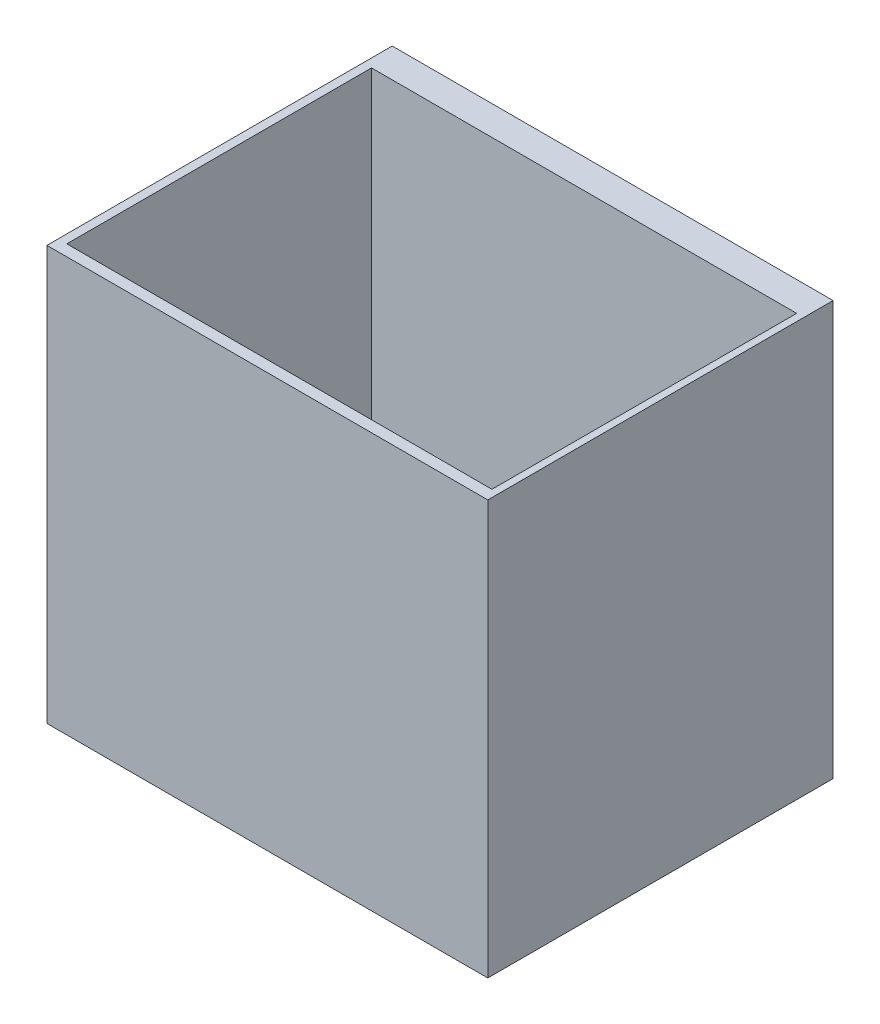
ISO-10303-21;
HEADER;
FILE_DESCRIPTION(('STEP AP214'),'2;1');
FILE_NAME('part.step','',(''),(''),'','','');
FILE_SCHEMA(('AUTOMOTIVE_DESIGN { 1 0 10303 214 1 1 1 1 }'));
ENDSEC;
DATA;
#1=APPLICATION_CONTEXT('core data for automotive mechanical design processes');
#2=APPLICATION_PROTOCOL_DEFINITION('international standard','automotive_design',2000,#1);
#3=PRODUCT_CONTEXT('',#1,'mechanical');
#4=PRODUCT('Part','Part','',(#3));
#5=PRODUCT_RELATED_PRODUCT_CATEGORY('part','',(#4));
#6=PRODUCT_DEFINITION_FORMATION('','',#4);
#7=PRODUCT_DEFINITION_CONTEXT('part definition',#1,'design');
#8=PRODUCT_DEFINITION('design','',#6,#7);
#9=PRODUCT_DEFINITION_SHAPE('','',#8);
#10=(LENGTH_UNIT() NAMED_UNIT(*) SI_UNIT(.MILLI.,.METRE.));
#11=(NAMED_UNIT(*) PLANE_ANGLE_UNIT() SI_UNIT($,.RADIAN.));
#12=(NAMED_UNIT(*) SI_UNIT($,.STERADIAN.) SOLID_ANGLE_UNIT());
#13=UNCERTAINTY_MEASURE_WITH_UNIT(LENGTH_MEASURE(1.E-05),#10,'distance_accuracy_value','');
#14=(GEOMETRIC_REPRESENTATION_CONTEXT(3) GLOBAL_UNCERTAINTY_ASSIGNED_CONTEXT((#13)) GLOBAL_UNIT_ASSIGNED_CONTEXT((#10,
#11,#12)) REPRESENTATION_CONTEXT('',''));
#15=CARTESIAN_POINT('',(0.,0.,0.));
#16=DIRECTION('',(0.,0.,1.));
#17=DIRECTION('',(1.,0.,0.));
#18=AXIS2_PLACEMENT_3D('',#15,#16,#17);
#19=CARTESIAN_POINT('',(518.159541103016,768.999999999999,2136.51077616825));
#20=DIRECTION('',(1.,0.,0.));
#21=DIRECTION('',(0.,0.,-1.));
#22=AXIS2_PLACEMENT_3D('',#19,#20,#21);
#23=PLANE('',#22);
#24=DIRECTION('',(0.,-1.,0.));
#25=VECTOR('',#24,1.);
#26=CARTESIAN_POINT('',(518.159541103016,768.999999999999,1653.51077616825));
#27=LINE('',#26,#25);
#28=CARTESIAN_POINT('',(518.159541103016,768.999999999999,1653.51077616825));
#29=VERTEX_POINT('',#28);
#30=CARTESIAN_POINT('',(518.159541103016,189.834965462087,1653.51077616825));
#31=VERTEX_POINT('',#30);
#32=EDGE_CURVE('E172',#29,#31,#27,.T.);
#33=ORIENTED_EDGE('',*,*,#32,.T.);
#34=DIRECTION('',(0.,0.,-1.));
#35=VECTOR('',#34,1.);
#36=CARTESIAN_POINT('',(518.159541103016,189.834965462087,2136.51077616825));
#37=LINE('',#36,#35);
#38=CARTESIAN_POINT('',(518.159541103016,189.834965462087,2136.51077616825));
#39=VERTEX_POINT('',#38);
#40=EDGE_CURVE('E11',#39,#31,#37,.T.);
#41=ORIENTED_EDGE('',*,*,#40,.F.);
#42=DIRECTION('',(0.,-1.,0.));
#43=VECTOR('',#42,1.);
#44=CARTESIAN_POINT('',(518.159541103016,768.999999999999,2136.51077616825));
#45=LINE('',#44,#43);
#46=CARTESIAN_POINT('',(518.159541103016,768.999999999999,2136.51077616825));
#47=VERTEX_POINT('',#46);
#48=EDGE_CURVE('E178',#47,#39,#45,.T.);
#49=ORIENTED_EDGE('',*,*,#48,.F.);
#50=DIRECTION('',(0.,0.,-1.));
#51=VECTOR('',#50,1.);
#52=CARTESIAN_POINT('',(518.159541103016,768.999999999999,2136.51077616825));
#53=LINE('',#52,#51);
#54=EDGE_CURVE('E188',#47,#29,#53,.T.);
#55=ORIENTED_EDGE('',*,*,#54,.T.);
#56=EDGE_LOOP('',(#33,#41,#49,#55));
#57=FACE_BOUND('',#56,.T.);
#58=ADVANCED_FACE('F33',(#57),#23,.F.);
#59=CARTESIAN_POINT('',(518.159541103016,189.834965462087,2136.51077616825));
#60=DIRECTION('',(0.,1.,0.));
#61=DIRECTION('',(0.,0.,1.));
#62=AXIS2_PLACEMENT_3D('',#59,#60,#61);
#63=PLANE('',#62);
#64=DIRECTION('',(1.,0.,0.));
#65=VECTOR('',#64,1.);
#66=CARTESIAN_POINT('',(518.159541103016,189.834965462087,1653.51077616825));
#67=LINE('',#66,#65);
#68=CARTESIAN_POINT('',(1134.86751024174,189.834965462087,1653.51077616825));
#69=VERTEX_POINT('',#68);
#70=EDGE_CURVE('E191',#31,#69,#67,.T.);
#71=ORIENTED_EDGE('',*,*,#70,.T.);
#72=DIRECTION('',(0.,0.,-1.));
#73=VECTOR('',#72,1.);
#74=CARTESIAN_POINT('',(1134.86751024174,189.834965462087,2136.51077616825));
#75=LINE('',#74,#73);
#76=CARTESIAN_POINT('',(1134.86751024174,189.834965462087,2136.51077616825));
#77=VERTEX_POINT('',#76);
#78=EDGE_CURVE('E40',#77,#69,#75,.T.);
#79=ORIENTED_EDGE('',*,*,#78,.F.);
#80=DIRECTION('',(1.,0.,0.));
#81=VECTOR('',#80,1.);
#82=CARTESIAN_POINT('',(518.159541103016,189.834965462087,2136.51077616825));
#83=LINE('',#82,#81);
#84=EDGE_CURVE('E181',#39,#77,#83,.T.);
#85=ORIENTED_EDGE('',*,*,#84,.F.);
#86=ORIENTED_EDGE('',*,*,#40,.T.);
#87=EDGE_LOOP('',(#71,#79,#85,#86));
#88=FACE_BOUND('',#87,.T.);
#89=ADVANCED_FACE('F219',(#88),#63,.F.);
#90=CARTESIAN_POINT('',(1134.86751024174,768.999999999999,2136.51077616825));
#91=DIRECTION('',(-1.,0.,0.));
#92=DIRECTION('',(0.,0.,1.));
#93=AXIS2_PLACEMENT_3D('',#90,#91,#92);
#94=PLANE('',#93);
#95=DIRECTION('',(0.,1.,0.));
#96=VECTOR('',#95,1.);
#97=CARTESIAN_POINT('',(1134.86751024174,768.999999999999,1653.51077616825));
#98=LINE('',#97,#96);
#99=CARTESIAN_POINT('',(1134.86751024174,768.999999999999,1653.51077616825));
#100=VERTEX_POINT('',#99);
#101=EDGE_CURVE('E193',#69,#100,#98,.T.);
#102=ORIENTED_EDGE('',*,*,#101,.T.);
#103=DIRECTION('',(0.,0.,-1.));
#104=VECTOR('',#103,1.);
#105=CARTESIAN_POINT('',(1134.86751024174,768.999999999999,2136.51077616825));
#106=LINE('',#105,#104);
#107=CARTESIAN_POINT('',(1134.86751024174,768.999999999999,2136.51077616825));
#108=VERTEX_POINT('',#107);
#109=EDGE_CURVE('E198',#108,#100,#106,.T.);
#110=ORIENTED_EDGE('',*,*,#109,.F.);
#111=DIRECTION('',(0.,1.,0.));
#112=VECTOR('',#111,1.);
#113=CARTESIAN_POINT('',(1134.86751024174,768.999999999999,2136.51077616825));
#114=LINE('',#113,#112);
#115=EDGE_CURVE('E184',#77,#108,#114,.T.);
#116=ORIENTED_EDGE('',*,*,#115,.F.);
#117=ORIENTED_EDGE('',*,*,#78,.T.);
#118=EDGE_LOOP('',(#102,#110,#116,#117));
#119=FACE_BOUND('',#118,.T.);
#120=ADVANCED_FACE('F205',(#119),#94,.F.);
#121=CARTESIAN_POINT('',(518.159541103016,768.999999999999,2136.51077616825));
#122=DIRECTION('',(0.,-1.,0.));
#123=DIRECTION('',(0.,0.,-1.));
#124=AXIS2_PLACEMENT_3D('',#121,#122,#123);
#125=PLANE('',#124);
#126=DIRECTION('',(-1.,0.,0.));
#127=VECTOR('',#126,1.);
#128=CARTESIAN_POINT('',(1124.90315803905,768.999999999999,1694.51391611529));
#129=LINE('',#128,#127);
#130=CARTESIAN_POINT('',(1124.90315803905,768.999999999999,1694.51391611529));
#131=VERTEX_POINT('',#130);
#132=CARTESIAN_POINT('',(530.230922992201,768.999999999999,1694.51391611529));
#133=VERTEX_POINT('',#132);
#134=EDGE_CURVE('E162',#131,#133,#129,.T.);
#135=ORIENTED_EDGE('',*,*,#134,.F.);
#136=DIRECTION('',(0.,0.,-1.));
#137=VECTOR('',#136,1.);
#138=CARTESIAN_POINT('',(1124.90315803905,768.999999999999,2120.74221603932));
#139=LINE('',#138,#137);
#140=CARTESIAN_POINT('',(1124.90315803905,768.999999999999,2120.74221603932));
#141=VERTEX_POINT('',#140);
#142=EDGE_CURVE('E55',#141,#131,#139,.T.);
#143=ORIENTED_EDGE('',*,*,#142,.F.);
#144=DIRECTION('',(1.,0.,0.));
#145=VECTOR('',#144,1.);
#146=CARTESIAN_POINT('',(1124.90315803905,768.999999999999,2120.74221603932));
#147=LINE('',#146,#145);
#148=CARTESIAN_POINT('',(530.230922992201,768.999999999999,2120.74221603932));
#149=VERTEX_POINT('',#148);
#150=EDGE_CURVE('E151',#149,#141,#147,.T.);
#151=ORIENTED_EDGE('',*,*,#150,.F.);
#152=DIRECTION('',(0.,0.,1.));
#153=VECTOR('',#152,1.);
#154=CARTESIAN_POINT('',(530.230922992201,768.999999999999,2120.74221603932));
#155=LINE('',#154,#153);
#156=EDGE_CURVE('E165',#133,#149,#155,.T.);
#157=ORIENTED_EDGE('',*,*,#156,.F.);
#158=EDGE_LOOP('',(#135,#143,#151,#157));
#159=FACE_BOUND('',#158,.T.);
#160=DIRECTION('',(-1.,0.,0.));
#161=VECTOR('',#160,1.);
#162=CARTESIAN_POINT('',(518.159541103016,768.999999999999,1653.51077616825));
#163=LINE('',#162,#161);
#164=EDGE_CURVE('E182',#100,#29,#163,.T.);
#165=ORIENTED_EDGE('',*,*,#164,.T.);
#166=ORIENTED_EDGE('',*,*,#54,.F.);
#167=DIRECTION('',(-1.,0.,0.));
#168=VECTOR('',#167,1.);
#169=CARTESIAN_POINT('',(518.159541103016,768.999999999999,2136.51077616825));
#170=LINE('',#169,#168);
#171=EDGE_CURVE('E186',#108,#47,#170,.T.);
#172=ORIENTED_EDGE('',*,*,#171,.F.);
#173=ORIENTED_EDGE('',*,*,#109,.T.);
#174=EDGE_LOOP('',(#165,#166,#172,#173));
#175=FACE_BOUND('',#174,.T.);
#176=ADVANCED_FACE('F212',(#159,#175),#125,.F.);
#177=CARTESIAN_POINT('',(0.,0.,2136.51077616825));
#178=DIRECTION('',(0.,0.,1.));
#179=DIRECTION('',(1.,0.,0.));
#180=AXIS2_PLACEMENT_3D('',#177,#178,#179);
#181=PLANE('',#180);
#182=ORIENTED_EDGE('',*,*,#48,.T.);
#183=ORIENTED_EDGE('',*,*,#84,.T.);
#184=ORIENTED_EDGE('',*,*,#115,.T.);
#185=ORIENTED_EDGE('',*,*,#171,.T.);
#186=EDGE_LOOP('',(#182,#183,#184,#185));
#187=FACE_BOUND('',#186,.T.);
#188=ADVANCED_FACE('F218',(#187),#181,.T.);
#189=CARTESIAN_POINT('',(0.,0.,1653.51077616825));
#190=DIRECTION('',(0.,0.,1.));
#191=DIRECTION('',(1.,0.,0.));
#192=AXIS2_PLACEMENT_3D('',#189,#190,#191);
#193=PLANE('',#192);
#194=DIRECTION('',(0.,1.,0.));
#195=VECTOR('',#194,1.);
#196=CARTESIAN_POINT('',(826.513525672378,645.999999999999,1653.51077616825));
#197=LINE('',#196,#195);
#198=CARTESIAN_POINT('',(826.513525672378,645.999999999999,1653.51077616825));
#199=VERTEX_POINT('',#198);
#200=CARTESIAN_POINT('',(826.513525672378,668.999999999999,1653.51077616825));
#201=VERTEX_POINT('',#200);
#202=EDGE_CURVE('E126',#199,#201,#197,.T.);
#203=ORIENTED_EDGE('',*,*,#202,.F.);
#204=DIRECTION('',(-1.,0.,0.));
#205=VECTOR('',#204,1.);
#206=CARTESIAN_POINT('',(882.617138285665,645.999999999999,1653.51077616825));
#207=LINE('',#206,#205);
#208=CARTESIAN_POINT('',(882.617138285665,645.999999999999,1653.51077616825));
#209=VERTEX_POINT('',#208);
#210=EDGE_CURVE('E131',#209,#199,#207,.T.);
#211=ORIENTED_EDGE('',*,*,#210,.F.);
#212=DIRECTION('',(0.,1.,0.));
#213=VECTOR('',#212,1.);
#214=CARTESIAN_POINT('',(882.617138285665,645.999999999999,1653.51077616825));
#215=LINE('',#214,#213);
#216=CARTESIAN_POINT('',(882.617138285665,668.999999999999,1653.51077616825));
#217=VERTEX_POINT('',#216);
#218=EDGE_CURVE('E117',#209,#217,#215,.T.);
#219=ORIENTED_EDGE('',*,*,#218,.T.);
#220=DIRECTION('',(-1.,0.,0.));
#221=VECTOR('',#220,1.);
#222=CARTESIAN_POINT('',(882.617138285665,668.999999999999,1653.51077616825));
#223=LINE('',#222,#221);
#224=EDGE_CURVE('E141',#217,#201,#223,.T.);
#225=ORIENTED_EDGE('',*,*,#224,.T.);
#226=EDGE_LOOP('',(#203,#211,#219,#225));
#227=FACE_BOUND('',#226,.T.);
#228=ORIENTED_EDGE('',*,*,#32,.F.);
#229=ORIENTED_EDGE('',*,*,#164,.F.);
#230=ORIENTED_EDGE('',*,*,#101,.F.);
#231=ORIENTED_EDGE('',*,*,#70,.F.);
#232=EDGE_LOOP('',(#228,#229,#230,#231));
#233=FACE_BOUND('',#232,.T.);
#234=ADVANCED_FACE('F135',(#227,#233),#193,.F.);
#235=CARTESIAN_POINT('',(1124.90315803905,200.999999999999,2120.74221603932));
#236=DIRECTION('',(1.,0.,0.));
#237=DIRECTION('',(0.,0.,-1.));
#238=AXIS2_PLACEMENT_3D('',#235,#236,#237);
#239=PLANE('',#238);
#240=ORIENTED_EDGE('',*,*,#142,.T.);
#241=DIRECTION('',(0.,1.,0.));
#242=VECTOR('',#241,1.);
#243=CARTESIAN_POINT('',(1124.90315803905,200.999999999999,1694.51391611529));
#244=LINE('',#243,#242);
#245=CARTESIAN_POINT('',(1124.90315803905,200.999999999999,1694.51391611529));
#246=VERTEX_POINT('',#245);
#247=EDGE_CURVE('E160',#246,#131,#244,.T.);
#248=ORIENTED_EDGE('',*,*,#247,.F.);
#249=DIRECTION('',(0.,0.,-1.));
#250=VECTOR('',#249,1.);
#251=CARTESIAN_POINT('',(1124.90315803905,200.999999999999,2120.74221603932));
#252=LINE('',#251,#250);
#253=CARTESIAN_POINT('',(1124.90315803905,200.999999999999,2120.74221603932));
#254=VERTEX_POINT('',#253);
#255=EDGE_CURVE('E147',#254,#246,#252,.T.);
#256=ORIENTED_EDGE('',*,*,#255,.F.);
#257=DIRECTION('',(0.,1.,0.));
#258=VECTOR('',#257,1.);
#259=CARTESIAN_POINT('',(1124.90315803905,200.999999999999,2120.74221603932));
#260=LINE('',#259,#258);
#261=EDGE_CURVE('E170',#254,#141,#260,.T.);
#262=ORIENTED_EDGE('',*,*,#261,.T.);
#263=EDGE_LOOP('',(#240,#248,#256,#262));
#264=FACE_BOUND('',#263,.T.);
#265=ADVANCED_FACE('F232',(#264),#239,.F.);
#266=CARTESIAN_POINT('',(1124.90315803905,200.999999999999,2120.74221603932));
#267=DIRECTION('',(0.,0.,1.));
#268=DIRECTION('',(1.,0.,0.));
#269=AXIS2_PLACEMENT_3D('',#266,#267,#268);
#270=PLANE('',#269);
#271=ORIENTED_EDGE('',*,*,#150,.T.);
#272=ORIENTED_EDGE('',*,*,#261,.F.);
#273=DIRECTION('',(1.,0.,0.));
#274=VECTOR('',#273,1.);
#275=CARTESIAN_POINT('',(1124.90315803905,200.999999999999,2120.74221603932));
#276=LINE('',#275,#274);
#277=CARTESIAN_POINT('',(530.230922992201,200.999999999999,2120.74221603932));
#278=VERTEX_POINT('',#277);
#279=EDGE_CURVE('E157',#278,#254,#276,.T.);
#280=ORIENTED_EDGE('',*,*,#279,.F.);
#281=DIRECTION('',(0.,1.,0.));
#282=VECTOR('',#281,1.);
#283=CARTESIAN_POINT('',(530.230922992201,200.999999999999,2120.74221603932));
#284=LINE('',#283,#282);
#285=EDGE_CURVE('E173',#278,#149,#284,.T.);
#286=ORIENTED_EDGE('',*,*,#285,.T.);
#287=EDGE_LOOP('',(#271,#272,#280,#286));
#288=FACE_BOUND('',#287,.T.);
#289=ADVANCED_FACE('F237',(#288),#270,.F.);
#290=CARTESIAN_POINT('',(530.230922992201,200.999999999999,2120.74221603932));
#291=DIRECTION('',(-1.,0.,0.));
#292=DIRECTION('',(0.,0.,1.));
#293=AXIS2_PLACEMENT_3D('',#290,#291,#292);
#294=PLANE('',#293);
#295=ORIENTED_EDGE('',*,*,#156,.T.);
#296=ORIENTED_EDGE('',*,*,#285,.F.);
#297=DIRECTION('',(0.,0.,1.));
#298=VECTOR('',#297,1.);
#299=CARTESIAN_POINT('',(530.230922992201,200.999999999999,2120.74221603932));
#300=LINE('',#299,#298);
#301=CARTESIAN_POINT('',(530.230922992201,200.999999999999,1694.51391611529));
#302=VERTEX_POINT('',#301);
#303=EDGE_CURVE('E154',#302,#278,#300,.T.);
#304=ORIENTED_EDGE('',*,*,#303,.F.);
#305=DIRECTION('',(0.,1.,0.));
#306=VECTOR('',#305,1.);
#307=CARTESIAN_POINT('',(530.230922992201,200.999999999999,1694.51391611529));
#308=LINE('',#307,#306);
#309=EDGE_CURVE('E175',#302,#133,#308,.T.);
#310=ORIENTED_EDGE('',*,*,#309,.T.);
#311=EDGE_LOOP('',(#295,#296,#304,#310));
#312=FACE_BOUND('',#311,.T.);
#313=ADVANCED_FACE('F242',(#312),#294,.F.);
#314=CARTESIAN_POINT('',(1124.90315803905,200.999999999999,1694.51391611529));
#315=DIRECTION('',(0.,0.,-1.));
#316=DIRECTION('',(-1.,0.,0.));
#317=AXIS2_PLACEMENT_3D('',#314,#315,#316);
#318=PLANE('',#317);
#319=ORIENTED_EDGE('',*,*,#134,.T.);
#320=ORIENTED_EDGE('',*,*,#309,.F.);
#321=DIRECTION('',(-1.,0.,0.));
#322=VECTOR('',#321,1.);
#323=CARTESIAN_POINT('',(1124.90315803905,200.999999999999,1694.51391611529));
#324=LINE('',#323,#322);
#325=EDGE_CURVE('E150',#246,#302,#324,.T.);
#326=ORIENTED_EDGE('',*,*,#325,.F.);
#327=ORIENTED_EDGE('',*,*,#247,.T.);
#328=EDGE_LOOP('',(#319,#320,#326,#327));
#329=FACE_BOUND('',#328,.T.);
#330=ADVANCED_FACE('F238',(#329),#318,.F.);
#331=CARTESIAN_POINT('',(0.,200.999999999999,0.));
#332=DIRECTION('',(0.,1.,0.));
#333=DIRECTION('',(0.,0.,1.));
#334=AXIS2_PLACEMENT_3D('',#331,#332,#333);
#335=PLANE('',#334);
#336=ORIENTED_EDGE('',*,*,#255,.T.);
#337=ORIENTED_EDGE('',*,*,#325,.T.);
#338=ORIENTED_EDGE('',*,*,#303,.T.);
#339=ORIENTED_EDGE('',*,*,#279,.T.);
#340=EDGE_LOOP('',(#336,#337,#338,#339));
#341=FACE_BOUND('',#340,.T.);
#342=ADVANCED_FACE('F241',(#341),#335,.T.);
#343=CARTESIAN_POINT('',(834.539329562589,645.999999999999,1624.60738194194));
#344=DIRECTION('',(0.,1.,0.));
#345=DIRECTION('',(0.,0.,1.));
#346=AXIS2_PLACEMENT_3D('',#343,#344,#345);
#347=CYLINDRICAL_SURFACE('',#346,56.0970755870057);
#348=CARTESIAN_POINT('',(834.539329562589,668.999999999999,1624.60738194194));
#349=DIRECTION('',(0.,1.,0.));
#350=DIRECTION('',(0.,0.,-1.));
#351=AXIS2_PLACEMENT_3D('',#348,#349,#350);
#352=CIRCLE('',#351,56.0970755870057);
#353=CARTESIAN_POINT('',(826.513525672378,668.999999999999,1680.12736358216));
#354=VERTEX_POINT('',#353);
#355=EDGE_CURVE('E122',#354,#217,#352,.T.);
#356=ORIENTED_EDGE('',*,*,#355,.T.);
#357=ORIENTED_EDGE('',*,*,#218,.F.);
#358=CARTESIAN_POINT('',(834.539329562589,645.999999999999,1624.60738194194));
#359=DIRECTION('',(0.,1.,0.));
#360=DIRECTION('',(0.,0.,-1.));
#361=AXIS2_PLACEMENT_3D('',#358,#359,#360);
#362=CIRCLE('',#361,56.0970755870057);
#363=CARTESIAN_POINT('',(826.513525672378,645.999999999999,1680.12736358216));
#364=VERTEX_POINT('',#363);
#365=EDGE_CURVE('E120',#364,#209,#362,.T.);
#366=ORIENTED_EDGE('',*,*,#365,.F.);
#367=DIRECTION('',(0.,1.,0.));
#368=VECTOR('',#367,1.);
#369=CARTESIAN_POINT('',(826.513525672378,645.999999999999,1680.12736358216));
#370=LINE('',#369,#368);
#371=EDGE_CURVE('E144',#364,#354,#370,.T.);
#372=ORIENTED_EDGE('',*,*,#371,.T.);
#373=EDGE_LOOP('',(#356,#357,#366,#372));
#374=FACE_BOUND('',#373,.T.);
#375=ADVANCED_FACE('F119',(#374),#347,.F.);
#376=CARTESIAN_POINT('',(826.513525672378,645.999999999999,1680.12736358216));
#377=DIRECTION('',(-1.,0.,0.));
#378=DIRECTION('',(0.,0.,1.));
#379=AXIS2_PLACEMENT_3D('',#376,#377,#378);
#380=PLANE('',#379);
#381=DIRECTION('',(0.,0.,1.));
#382=VECTOR('',#381,1.);
#383=CARTESIAN_POINT('',(826.513525672378,668.999999999999,1680.12736358216));
#384=LINE('',#383,#382);
#385=EDGE_CURVE('E47',#201,#354,#384,.T.);
#386=ORIENTED_EDGE('',*,*,#385,.T.);
#387=ORIENTED_EDGE('',*,*,#371,.F.);
#388=DIRECTION('',(0.,0.,1.));
#389=VECTOR('',#388,1.);
#390=CARTESIAN_POINT('',(826.513525672378,645.999999999999,1680.12736358216));
#391=LINE('',#390,#389);
#392=EDGE_CURVE('E127',#199,#364,#391,.T.);
#393=ORIENTED_EDGE('',*,*,#392,.F.);
#394=ORIENTED_EDGE('',*,*,#202,.T.);
#395=EDGE_LOOP('',(#386,#387,#393,#394));
#396=FACE_BOUND('',#395,.T.);
#397=ADVANCED_FACE('F255',(#396),#380,.F.);
#398=CARTESIAN_POINT('',(834.539329562589,645.999999999999,1624.60738194194));
#399=DIRECTION('',(0.,-1.,0.));
#400=DIRECTION('',(0.,0.,-1.));
#401=AXIS2_PLACEMENT_3D('',#398,#399,#400);
#402=PLANE('',#401);
#403=ORIENTED_EDGE('',*,*,#365,.T.);
#404=ORIENTED_EDGE('',*,*,#210,.T.);
#405=ORIENTED_EDGE('',*,*,#392,.T.);
#406=EDGE_LOOP('',(#403,#404,#405));
#407=FACE_BOUND('',#406,.T.);
#408=ADVANCED_FACE('F130',(#407),#402,.F.);
#409=CARTESIAN_POINT('',(834.539329562589,668.999999999999,1624.60738194194));
#410=DIRECTION('',(0.,-1.,0.));
#411=DIRECTION('',(0.,0.,-1.));
#412=AXIS2_PLACEMENT_3D('',#409,#410,#411);
#413=PLANE('',#412);
#414=ORIENTED_EDGE('',*,*,#355,.F.);
#415=ORIENTED_EDGE('',*,*,#385,.F.);
#416=ORIENTED_EDGE('',*,*,#224,.F.);
#417=EDGE_LOOP('',(#414,#415,#416));
#418=FACE_BOUND('',#417,.T.);
#419=ADVANCED_FACE('F259',(#418),#413,.T.);
#420=CLOSED_SHELL('',(#58,#89,#120,#176,#188,#234,#265,#289,#313,#330,#342,#375,#397,#408,#419));
#421=MANIFOLD_SOLID_BREP('B2',#420);
#422=ADVANCED_BREP_SHAPE_REPRESENTATION('',(#18,#421),#14);
#423=SHAPE_DEFINITION_REPRESENTATION(#9,#422);
ENDSEC;
END-ISO-10303-21;
